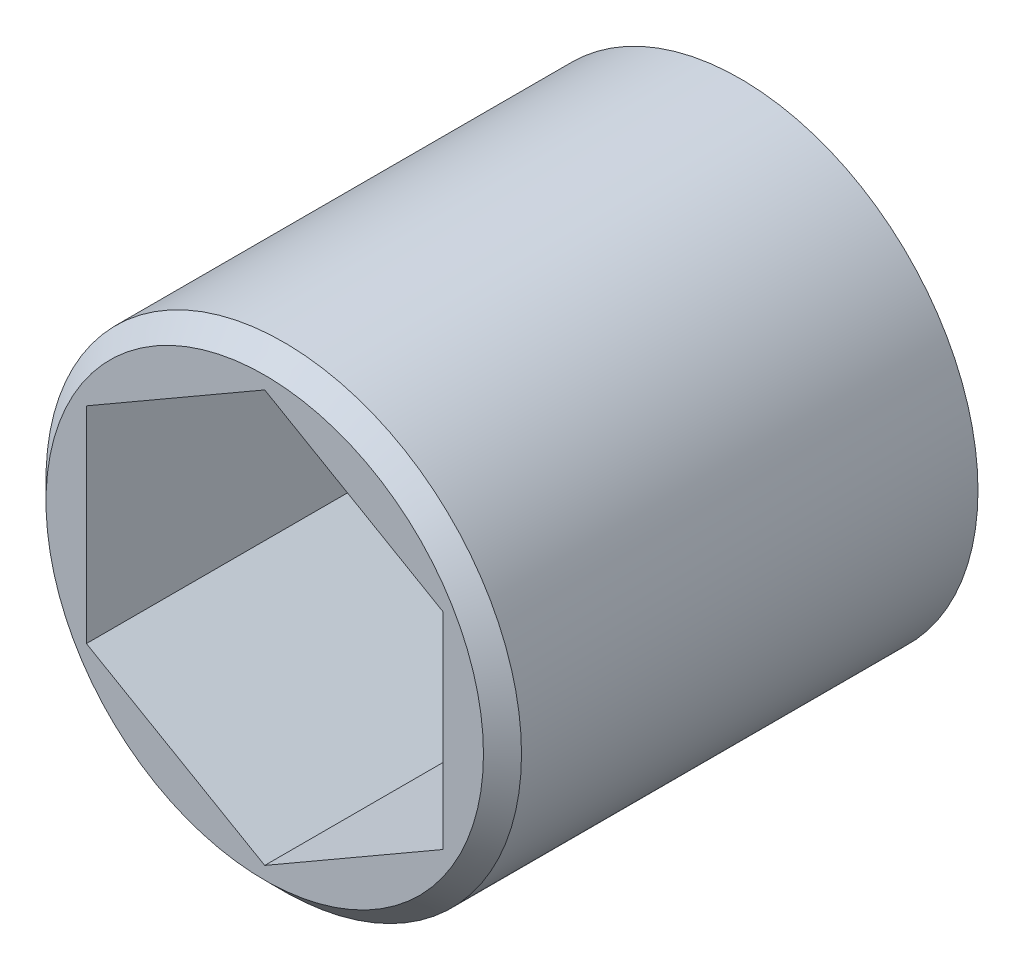
ISO-10303-21;
HEADER;
FILE_DESCRIPTION(('STEP AP214'),'2;1');
FILE_NAME('part.step','',(''),(''),'','','');
FILE_SCHEMA(('AUTOMOTIVE_DESIGN { 1 0 10303 214 1 1 1 1 }'));
ENDSEC;
DATA;
#1=APPLICATION_CONTEXT('core data for automotive mechanical design processes');
#2=APPLICATION_PROTOCOL_DEFINITION('international standard','automotive_design',2000,#1);
#3=PRODUCT_CONTEXT('',#1,'mechanical');
#4=PRODUCT('Part','Part','',(#3));
#5=PRODUCT_RELATED_PRODUCT_CATEGORY('part','',(#4));
#6=PRODUCT_DEFINITION_FORMATION('','',#4);
#7=PRODUCT_DEFINITION_CONTEXT('part definition',#1,'design');
#8=PRODUCT_DEFINITION('design','',#6,#7);
#9=PRODUCT_DEFINITION_SHAPE('','',#8);
#10=(LENGTH_UNIT() NAMED_UNIT(*) SI_UNIT(.MILLI.,.METRE.));
#11=(NAMED_UNIT(*) PLANE_ANGLE_UNIT() SI_UNIT($,.RADIAN.));
#12=(NAMED_UNIT(*) SI_UNIT($,.STERADIAN.) SOLID_ANGLE_UNIT());
#13=UNCERTAINTY_MEASURE_WITH_UNIT(LENGTH_MEASURE(1.E-05),#10,'distance_accuracy_value','');
#14=(GEOMETRIC_REPRESENTATION_CONTEXT(3) GLOBAL_UNCERTAINTY_ASSIGNED_CONTEXT((#13)) GLOBAL_UNIT_ASSIGNED_CONTEXT((#10,
#11,#12)) REPRESENTATION_CONTEXT('',''));
#15=CARTESIAN_POINT('',(0.,0.,0.));
#16=DIRECTION('',(0.,0.,1.));
#17=DIRECTION('',(1.,0.,0.));
#18=AXIS2_PLACEMENT_3D('',#15,#16,#17);
#19=CARTESIAN_POINT('',(0.,0.,12.7));
#20=DIRECTION('',(0.,0.,-1.));
#21=DIRECTION('',(-1.,0.,0.));
#22=AXIS2_PLACEMENT_3D('',#19,#20,#21);
#23=CYLINDRICAL_SURFACE('',#22,6.35);
#24=CARTESIAN_POINT('',(0.,0.,12.192));
#25=DIRECTION('',(0.,0.,1.));
#26=DIRECTION('',(1.,0.,0.));
#27=AXIS2_PLACEMENT_3D('',#24,#25,#26);
#28=CIRCLE('',#27,6.35);
#29=CARTESIAN_POINT('',(6.35,0.,12.192));
#30=VERTEX_POINT('',#29);
#31=EDGE_CURVE('E11',#30,#30,#28,.F.);
#32=ORIENTED_EDGE('',*,*,#31,.T.);
#33=EDGE_LOOP('',(#32));
#34=FACE_BOUND('',#33,.T.);
#35=CARTESIAN_POINT('',(0.,0.,0.));
#36=DIRECTION('',(0.,0.,1.));
#37=DIRECTION('',(1.,0.,0.));
#38=AXIS2_PLACEMENT_3D('',#35,#36,#37);
#39=CIRCLE('',#38,6.35);
#40=CARTESIAN_POINT('',(6.35,0.,0.));
#41=VERTEX_POINT('',#40);
#42=EDGE_CURVE('E214',#41,#41,#39,.T.);
#43=ORIENTED_EDGE('',*,*,#42,.T.);
#44=EDGE_LOOP('',(#43));
#45=FACE_BOUND('',#44,.T.);
#46=ADVANCED_FACE('F46',(#34,#45),#23,.T.);
#47=CARTESIAN_POINT('',(0.,0.,12.7));
#48=DIRECTION('',(0.,0.,1.));
#49=DIRECTION('',(1.,0.,0.));
#50=AXIS2_PLACEMENT_3D('',#47,#48,#49);
#51=PLANE('',#50);
#52=CARTESIAN_POINT('',(0.,0.,12.7));
#53=DIRECTION('',(0.,0.,1.));
#54=DIRECTION('',(1.,0.,0.));
#55=AXIS2_PLACEMENT_3D('',#52,#53,#54);
#56=CIRCLE('',#55,5.842);
#57=CARTESIAN_POINT('',(5.842,0.,12.7));
#58=VERTEX_POINT('',#57);
#59=EDGE_CURVE('E56',#58,#58,#56,.T.);
#60=ORIENTED_EDGE('',*,*,#59,.T.);
#61=EDGE_LOOP('',(#60));
#62=FACE_BOUND('',#61,.T.);
#63=DIRECTION('',(0.866025403784439,-0.5,0.));
#64=VECTOR('',#63,1.);
#65=CARTESIAN_POINT('',(-4.7625,-2.74963065701559,12.7));
#66=LINE('',#65,#64);
#67=CARTESIAN_POINT('',(-4.7625,-2.74963065701559,12.7));
#68=VERTEX_POINT('',#67);
#69=CARTESIAN_POINT('',(0.,-5.49926131403119,12.7));
#70=VERTEX_POINT('',#69);
#71=EDGE_CURVE('E158',#68,#70,#66,.T.);
#72=ORIENTED_EDGE('',*,*,#71,.F.);
#73=DIRECTION('',(0.,-1.,0.));
#74=VECTOR('',#73,1.);
#75=CARTESIAN_POINT('',(-4.7625,2.74963065701559,12.7));
#76=LINE('',#75,#74);
#77=CARTESIAN_POINT('',(-4.7625,2.74963065701559,12.7));
#78=VERTEX_POINT('',#77);
#79=EDGE_CURVE('E169',#78,#68,#76,.T.);
#80=ORIENTED_EDGE('',*,*,#79,.F.);
#81=DIRECTION('',(-0.866025403784438,-0.5,0.));
#82=VECTOR('',#81,1.);
#83=CARTESIAN_POINT('',(0.,5.49926131403119,12.7));
#84=LINE('',#83,#82);
#85=CARTESIAN_POINT('',(0.,5.49926131403119,12.7));
#86=VERTEX_POINT('',#85);
#87=EDGE_CURVE('E204',#86,#78,#84,.T.);
#88=ORIENTED_EDGE('',*,*,#87,.F.);
#89=DIRECTION('',(-0.866025403784439,0.5,0.));
#90=VECTOR('',#89,1.);
#91=CARTESIAN_POINT('',(4.7625,2.7496306570156,12.7));
#92=LINE('',#91,#90);
#93=CARTESIAN_POINT('',(4.7625,2.7496306570156,12.7));
#94=VERTEX_POINT('',#93);
#95=EDGE_CURVE('E200',#94,#86,#92,.T.);
#96=ORIENTED_EDGE('',*,*,#95,.F.);
#97=DIRECTION('',(0.,1.,0.));
#98=VECTOR('',#97,1.);
#99=CARTESIAN_POINT('',(4.7625,-2.74963065701559,12.7));
#100=LINE('',#99,#98);
#101=CARTESIAN_POINT('',(4.7625,-2.74963065701559,12.7));
#102=VERTEX_POINT('',#101);
#103=EDGE_CURVE('E196',#102,#94,#100,.T.);
#104=ORIENTED_EDGE('',*,*,#103,.F.);
#105=DIRECTION('',(0.866025403784439,0.5,0.));
#106=VECTOR('',#105,1.);
#107=CARTESIAN_POINT('',(0.,-5.49926131403118,12.7));
#108=LINE('',#107,#106);
#109=EDGE_CURVE('E192',#70,#102,#108,.T.);
#110=ORIENTED_EDGE('',*,*,#109,.F.);
#111=EDGE_LOOP('',(#72,#80,#88,#96,#104,#110));
#112=FACE_BOUND('',#111,.T.);
#113=ADVANCED_FACE('F249',(#62,#112),#51,.T.);
#114=CARTESIAN_POINT('',(0.,0.,0.));
#115=DIRECTION('',(0.,0.,1.));
#116=DIRECTION('',(1.,0.,0.));
#117=AXIS2_PLACEMENT_3D('',#114,#115,#116);
#118=PLANE('',#117);
#119=DIRECTION('',(1.,0.,0.));
#120=VECTOR('',#119,1.);
#121=CARTESIAN_POINT('',(0.,-2.54,0.));
#122=LINE('',#121,#120);
#123=CARTESIAN_POINT('',(-2.54,-2.54,0.));
#124=VERTEX_POINT('',#123);
#125=CARTESIAN_POINT('',(2.54,-2.54,0.));
#126=VERTEX_POINT('',#125);
#127=EDGE_CURVE('E239',#124,#126,#122,.T.);
#128=ORIENTED_EDGE('',*,*,#127,.T.);
#129=DIRECTION('',(0.,1.,0.));
#130=VECTOR('',#129,1.);
#131=CARTESIAN_POINT('',(2.54,0.,0.));
#132=LINE('',#131,#130);
#133=CARTESIAN_POINT('',(2.54,2.54,0.));
#134=VERTEX_POINT('',#133);
#135=EDGE_CURVE('E243',#126,#134,#132,.T.);
#136=ORIENTED_EDGE('',*,*,#135,.T.);
#137=DIRECTION('',(-1.,0.,0.));
#138=VECTOR('',#137,1.);
#139=CARTESIAN_POINT('',(0.,2.54,0.));
#140=LINE('',#139,#138);
#141=CARTESIAN_POINT('',(-2.54,2.54,0.));
#142=VERTEX_POINT('',#141);
#143=EDGE_CURVE('E130',#134,#142,#140,.T.);
#144=ORIENTED_EDGE('',*,*,#143,.T.);
#145=DIRECTION('',(0.,-1.,0.));
#146=VECTOR('',#145,1.);
#147=CARTESIAN_POINT('',(-2.54,0.,0.));
#148=LINE('',#147,#146);
#149=EDGE_CURVE('E235',#142,#124,#148,.T.);
#150=ORIENTED_EDGE('',*,*,#149,.T.);
#151=EDGE_LOOP('',(#128,#136,#144,#150));
#152=FACE_BOUND('',#151,.T.);
#153=ORIENTED_EDGE('',*,*,#42,.F.);
#154=EDGE_LOOP('',(#153));
#155=FACE_BOUND('',#154,.T.);
#156=ADVANCED_FACE('F266',(#152,#155),#118,.F.);
#157=CARTESIAN_POINT('',(-4.7625,-2.74963065701559,3.175));
#158=DIRECTION('',(-0.5,-0.866025403784439,0.));
#159=DIRECTION('',(0.866025403784439,-0.5,0.));
#160=AXIS2_PLACEMENT_3D('',#157,#158,#159);
#161=PLANE('',#160);
#162=ORIENTED_EDGE('',*,*,#71,.T.);
#163=DIRECTION('',(0.,0.,1.));
#164=VECTOR('',#163,1.);
#165=CARTESIAN_POINT('',(0.,-5.49926131403118,3.175));
#166=LINE('',#165,#164);
#167=CARTESIAN_POINT('',(0.,-5.49926131403118,3.175));
#168=VERTEX_POINT('',#167);
#169=EDGE_CURVE('E189',#168,#70,#166,.T.);
#170=ORIENTED_EDGE('',*,*,#169,.F.);
#171=DIRECTION('',(0.866025403784439,-0.5,0.));
#172=VECTOR('',#171,1.);
#173=CARTESIAN_POINT('',(-4.7625,-2.74963065701559,3.175));
#174=LINE('',#173,#172);
#175=CARTESIAN_POINT('',(-4.7625,-2.74963065701559,3.175));
#176=VERTEX_POINT('',#175);
#177=EDGE_CURVE('E164',#176,#168,#174,.T.);
#178=ORIENTED_EDGE('',*,*,#177,.F.);
#179=DIRECTION('',(0.,0.,1.));
#180=VECTOR('',#179,1.);
#181=CARTESIAN_POINT('',(-4.7625,-2.74963065701559,3.175));
#182=LINE('',#181,#180);
#183=EDGE_CURVE('E211',#176,#68,#182,.T.);
#184=ORIENTED_EDGE('',*,*,#183,.T.);
#185=EDGE_LOOP('',(#162,#170,#178,#184));
#186=FACE_BOUND('',#185,.T.);
#187=ADVANCED_FACE('F271',(#186),#161,.F.);
#188=CARTESIAN_POINT('',(-4.7625,2.74963065701559,3.175));
#189=DIRECTION('',(-1.,0.,0.));
#190=DIRECTION('',(0.,-1.,0.));
#191=AXIS2_PLACEMENT_3D('',#188,#189,#190);
#192=PLANE('',#191);
#193=ORIENTED_EDGE('',*,*,#79,.T.);
#194=ORIENTED_EDGE('',*,*,#183,.F.);
#195=DIRECTION('',(0.,-1.,0.));
#196=VECTOR('',#195,1.);
#197=CARTESIAN_POINT('',(-4.7625,2.74963065701559,3.175));
#198=LINE('',#197,#196);
#199=CARTESIAN_POINT('',(-4.7625,2.74963065701559,3.175));
#200=VERTEX_POINT('',#199);
#201=EDGE_CURVE('E185',#200,#176,#198,.T.);
#202=ORIENTED_EDGE('',*,*,#201,.F.);
#203=DIRECTION('',(0.,0.,1.));
#204=VECTOR('',#203,1.);
#205=CARTESIAN_POINT('',(-4.7625,2.74963065701559,3.175));
#206=LINE('',#205,#204);
#207=EDGE_CURVE('E215',#200,#78,#206,.T.);
#208=ORIENTED_EDGE('',*,*,#207,.T.);
#209=EDGE_LOOP('',(#193,#194,#202,#208));
#210=FACE_BOUND('',#209,.T.);
#211=ADVANCED_FACE('F276',(#210),#192,.F.);
#212=CARTESIAN_POINT('',(0.,5.49926131403119,3.175));
#213=DIRECTION('',(-0.5,0.866025403784439,0.));
#214=DIRECTION('',(-0.866025403784438,-0.5,0.));
#215=AXIS2_PLACEMENT_3D('',#212,#213,#214);
#216=PLANE('',#215);
#217=ORIENTED_EDGE('',*,*,#87,.T.);
#218=ORIENTED_EDGE('',*,*,#207,.F.);
#219=DIRECTION('',(-0.866025403784438,-0.5,0.));
#220=VECTOR('',#219,1.);
#221=CARTESIAN_POINT('',(0.,5.49926131403119,3.175));
#222=LINE('',#221,#220);
#223=CARTESIAN_POINT('',(0.,5.49926131403119,3.175));
#224=VERTEX_POINT('',#223);
#225=EDGE_CURVE('E181',#224,#200,#222,.T.);
#226=ORIENTED_EDGE('',*,*,#225,.F.);
#227=DIRECTION('',(0.,0.,1.));
#228=VECTOR('',#227,1.);
#229=CARTESIAN_POINT('',(0.,5.49926131403119,3.175));
#230=LINE('',#229,#228);
#231=EDGE_CURVE('E218',#224,#86,#230,.T.);
#232=ORIENTED_EDGE('',*,*,#231,.T.);
#233=EDGE_LOOP('',(#217,#218,#226,#232));
#234=FACE_BOUND('',#233,.T.);
#235=ADVANCED_FACE('F289',(#234),#216,.F.);
#236=CARTESIAN_POINT('',(4.7625,2.7496306570156,3.175));
#237=DIRECTION('',(0.5,0.866025403784439,0.));
#238=DIRECTION('',(-0.866025403784439,0.5,0.));
#239=AXIS2_PLACEMENT_3D('',#236,#237,#238);
#240=PLANE('',#239);
#241=ORIENTED_EDGE('',*,*,#95,.T.);
#242=ORIENTED_EDGE('',*,*,#231,.F.);
#243=DIRECTION('',(-0.866025403784439,0.5,0.));
#244=VECTOR('',#243,1.);
#245=CARTESIAN_POINT('',(4.7625,2.7496306570156,3.175));
#246=LINE('',#245,#244);
#247=CARTESIAN_POINT('',(4.7625,2.7496306570156,3.175));
#248=VERTEX_POINT('',#247);
#249=EDGE_CURVE('E177',#248,#224,#246,.T.);
#250=ORIENTED_EDGE('',*,*,#249,.F.);
#251=DIRECTION('',(0.,0.,1.));
#252=VECTOR('',#251,1.);
#253=CARTESIAN_POINT('',(4.7625,2.7496306570156,3.175));
#254=LINE('',#253,#252);
#255=EDGE_CURVE('E221',#248,#94,#254,.T.);
#256=ORIENTED_EDGE('',*,*,#255,.T.);
#257=EDGE_LOOP('',(#241,#242,#250,#256));
#258=FACE_BOUND('',#257,.T.);
#259=ADVANCED_FACE('F285',(#258),#240,.F.);
#260=CARTESIAN_POINT('',(4.7625,-2.74963065701559,3.175));
#261=DIRECTION('',(1.,0.,0.));
#262=DIRECTION('',(0.,1.,0.));
#263=AXIS2_PLACEMENT_3D('',#260,#261,#262);
#264=PLANE('',#263);
#265=ORIENTED_EDGE('',*,*,#103,.T.);
#266=ORIENTED_EDGE('',*,*,#255,.F.);
#267=DIRECTION('',(0.,1.,0.));
#268=VECTOR('',#267,1.);
#269=CARTESIAN_POINT('',(4.7625,-2.74963065701559,3.175));
#270=LINE('',#269,#268);
#271=CARTESIAN_POINT('',(4.7625,-2.74963065701559,3.175));
#272=VERTEX_POINT('',#271);
#273=EDGE_CURVE('E173',#272,#248,#270,.T.);
#274=ORIENTED_EDGE('',*,*,#273,.F.);
#275=DIRECTION('',(0.,0.,1.));
#276=VECTOR('',#275,1.);
#277=CARTESIAN_POINT('',(4.7625,-2.74963065701559,3.175));
#278=LINE('',#277,#276);
#279=EDGE_CURVE('E224',#272,#102,#278,.T.);
#280=ORIENTED_EDGE('',*,*,#279,.T.);
#281=EDGE_LOOP('',(#265,#266,#274,#280));
#282=FACE_BOUND('',#281,.T.);
#283=ADVANCED_FACE('F281',(#282),#264,.F.);
#284=CARTESIAN_POINT('',(0.,-5.49926131403118,3.175));
#285=DIRECTION('',(0.5,-0.866025403784439,0.));
#286=DIRECTION('',(0.866025403784439,0.5,0.));
#287=AXIS2_PLACEMENT_3D('',#284,#285,#286);
#288=PLANE('',#287);
#289=ORIENTED_EDGE('',*,*,#109,.T.);
#290=ORIENTED_EDGE('',*,*,#279,.F.);
#291=DIRECTION('',(0.866025403784439,0.5,0.));
#292=VECTOR('',#291,1.);
#293=CARTESIAN_POINT('',(0.,-5.49926131403118,3.175));
#294=LINE('',#293,#292);
#295=EDGE_CURVE('E168',#168,#272,#294,.T.);
#296=ORIENTED_EDGE('',*,*,#295,.F.);
#297=ORIENTED_EDGE('',*,*,#169,.T.);
#298=EDGE_LOOP('',(#289,#290,#296,#297));
#299=FACE_BOUND('',#298,.T.);
#300=ADVANCED_FACE('F278',(#299),#288,.F.);
#301=CARTESIAN_POINT('',(0.,0.,3.175));
#302=DIRECTION('',(0.,0.,1.));
#303=DIRECTION('',(1.,0.,0.));
#304=AXIS2_PLACEMENT_3D('',#301,#302,#303);
#305=PLANE('',#304);
#306=DIRECTION('',(0.,1.,0.));
#307=VECTOR('',#306,1.);
#308=CARTESIAN_POINT('',(2.54,2.54,3.175));
#309=LINE('',#308,#307);
#310=CARTESIAN_POINT('',(2.54,-2.54,3.175));
#311=VERTEX_POINT('',#310);
#312=CARTESIAN_POINT('',(2.54,2.54,3.175));
#313=VERTEX_POINT('',#312);
#314=EDGE_CURVE('E137',#311,#313,#309,.T.);
#315=ORIENTED_EDGE('',*,*,#314,.F.);
#316=DIRECTION('',(1.,0.,0.));
#317=VECTOR('',#316,1.);
#318=CARTESIAN_POINT('',(-2.54,-2.54,3.175));
#319=LINE('',#318,#317);
#320=CARTESIAN_POINT('',(-2.54,-2.54,3.175));
#321=VERTEX_POINT('',#320);
#322=EDGE_CURVE('E134',#321,#311,#319,.T.);
#323=ORIENTED_EDGE('',*,*,#322,.F.);
#324=DIRECTION('',(0.,-1.,0.));
#325=VECTOR('',#324,1.);
#326=CARTESIAN_POINT('',(-2.54,2.54,3.175));
#327=LINE('',#326,#325);
#328=CARTESIAN_POINT('',(-2.54,2.54,3.175));
#329=VERTEX_POINT('',#328);
#330=EDGE_CURVE('E63',#329,#321,#327,.T.);
#331=ORIENTED_EDGE('',*,*,#330,.F.);
#332=DIRECTION('',(-1.,0.,0.));
#333=VECTOR('',#332,1.);
#334=CARTESIAN_POINT('',(-2.54,2.54,3.175));
#335=LINE('',#334,#333);
#336=EDGE_CURVE('E128',#313,#329,#335,.T.);
#337=ORIENTED_EDGE('',*,*,#336,.F.);
#338=EDGE_LOOP('',(#315,#323,#331,#337));
#339=FACE_BOUND('',#338,.T.);
#340=ORIENTED_EDGE('',*,*,#177,.T.);
#341=ORIENTED_EDGE('',*,*,#295,.T.);
#342=ORIENTED_EDGE('',*,*,#273,.T.);
#343=ORIENTED_EDGE('',*,*,#249,.T.);
#344=ORIENTED_EDGE('',*,*,#225,.T.);
#345=ORIENTED_EDGE('',*,*,#201,.T.);
#346=EDGE_LOOP('',(#340,#341,#342,#343,#344,#345));
#347=FACE_BOUND('',#346,.T.);
#348=ADVANCED_FACE('F146',(#339,#347),#305,.T.);
#349=CARTESIAN_POINT('',(2.54,2.54,-6.35));
#350=DIRECTION('',(1.,0.,0.));
#351=DIRECTION('',(0.,0.,-1.));
#352=AXIS2_PLACEMENT_3D('',#349,#350,#351);
#353=PLANE('',#352);
#354=DIRECTION('',(0.,0.,1.));
#355=VECTOR('',#354,1.);
#356=CARTESIAN_POINT('',(2.54,-2.54,-6.35));
#357=LINE('',#356,#355);
#358=EDGE_CURVE('E140',#126,#311,#357,.T.);
#359=ORIENTED_EDGE('',*,*,#358,.T.);
#360=ORIENTED_EDGE('',*,*,#314,.T.);
#361=DIRECTION('',(0.,0.,1.));
#362=VECTOR('',#361,1.);
#363=CARTESIAN_POINT('',(2.54,2.54,-6.35));
#364=LINE('',#363,#362);
#365=EDGE_CURVE('E124',#134,#313,#364,.T.);
#366=ORIENTED_EDGE('',*,*,#365,.F.);
#367=ORIENTED_EDGE('',*,*,#135,.F.);
#368=EDGE_LOOP('',(#359,#360,#366,#367));
#369=FACE_BOUND('',#368,.T.);
#370=ADVANCED_FACE('F138',(#369),#353,.F.);
#371=CARTESIAN_POINT('',(-2.54,-2.54,-6.35));
#372=DIRECTION('',(0.,-1.,0.));
#373=DIRECTION('',(0.,0.,-1.));
#374=AXIS2_PLACEMENT_3D('',#371,#372,#373);
#375=PLANE('',#374);
#376=DIRECTION('',(0.,0.,1.));
#377=VECTOR('',#376,1.);
#378=CARTESIAN_POINT('',(-2.54,-2.54,-6.35));
#379=LINE('',#378,#377);
#380=EDGE_CURVE('E159',#124,#321,#379,.T.);
#381=ORIENTED_EDGE('',*,*,#380,.T.);
#382=ORIENTED_EDGE('',*,*,#322,.T.);
#383=ORIENTED_EDGE('',*,*,#358,.F.);
#384=ORIENTED_EDGE('',*,*,#127,.F.);
#385=EDGE_LOOP('',(#381,#382,#383,#384));
#386=FACE_BOUND('',#385,.T.);
#387=ADVANCED_FACE('F300',(#386),#375,.F.);
#388=CARTESIAN_POINT('',(-2.54,2.54,-6.35));
#389=DIRECTION('',(-1.,0.,0.));
#390=DIRECTION('',(0.,-1.,0.));
#391=AXIS2_PLACEMENT_3D('',#388,#389,#390);
#392=PLANE('',#391);
#393=DIRECTION('',(0.,0.,1.));
#394=VECTOR('',#393,1.);
#395=CARTESIAN_POINT('',(-2.54,2.54,-6.35));
#396=LINE('',#395,#394);
#397=EDGE_CURVE('E70',#142,#329,#396,.T.);
#398=ORIENTED_EDGE('',*,*,#397,.T.);
#399=ORIENTED_EDGE('',*,*,#330,.T.);
#400=ORIENTED_EDGE('',*,*,#380,.F.);
#401=ORIENTED_EDGE('',*,*,#149,.F.);
#402=EDGE_LOOP('',(#398,#399,#400,#401));
#403=FACE_BOUND('',#402,.T.);
#404=ADVANCED_FACE('F257',(#403),#392,.F.);
#405=CARTESIAN_POINT('',(-2.54,2.54,-6.35));
#406=DIRECTION('',(0.,1.,0.));
#407=DIRECTION('',(0.,0.,1.));
#408=AXIS2_PLACEMENT_3D('',#405,#406,#407);
#409=PLANE('',#408);
#410=ORIENTED_EDGE('',*,*,#365,.T.);
#411=ORIENTED_EDGE('',*,*,#336,.T.);
#412=ORIENTED_EDGE('',*,*,#397,.F.);
#413=ORIENTED_EDGE('',*,*,#143,.F.);
#414=EDGE_LOOP('',(#410,#411,#412,#413));
#415=FACE_BOUND('',#414,.T.);
#416=ADVANCED_FACE('F126',(#415),#409,.F.);
#417=CARTESIAN_POINT('',(0.,0.,12.7));
#418=DIRECTION('',(0.,0.,-1.));
#419=DIRECTION('',(-1.,0.,0.));
#420=AXIS2_PLACEMENT_3D('',#417,#418,#419);
#421=CONICAL_SURFACE('',#420,5.842,0.785398163397448);
#422=ORIENTED_EDGE('',*,*,#31,.F.);
#423=EDGE_LOOP('',(#422));
#424=FACE_BOUND('',#423,.T.);
#425=ORIENTED_EDGE('',*,*,#59,.F.);
#426=EDGE_LOOP('',(#425));
#427=FACE_BOUND('',#426,.T.);
#428=ADVANCED_FACE('F49',(#424,#427),#421,.T.);
#429=CLOSED_SHELL('',(#46,#113,#156,#187,#211,#235,#259,#283,#300,#348,#370,#387,#404,#416,#428));
#430=MANIFOLD_SOLID_BREP('B2',#429);
#431=ADVANCED_BREP_SHAPE_REPRESENTATION('',(#18,#430),#14);
#432=SHAPE_DEFINITION_REPRESENTATION(#9,#431);
ENDSEC;
END-ISO-10303-21;
